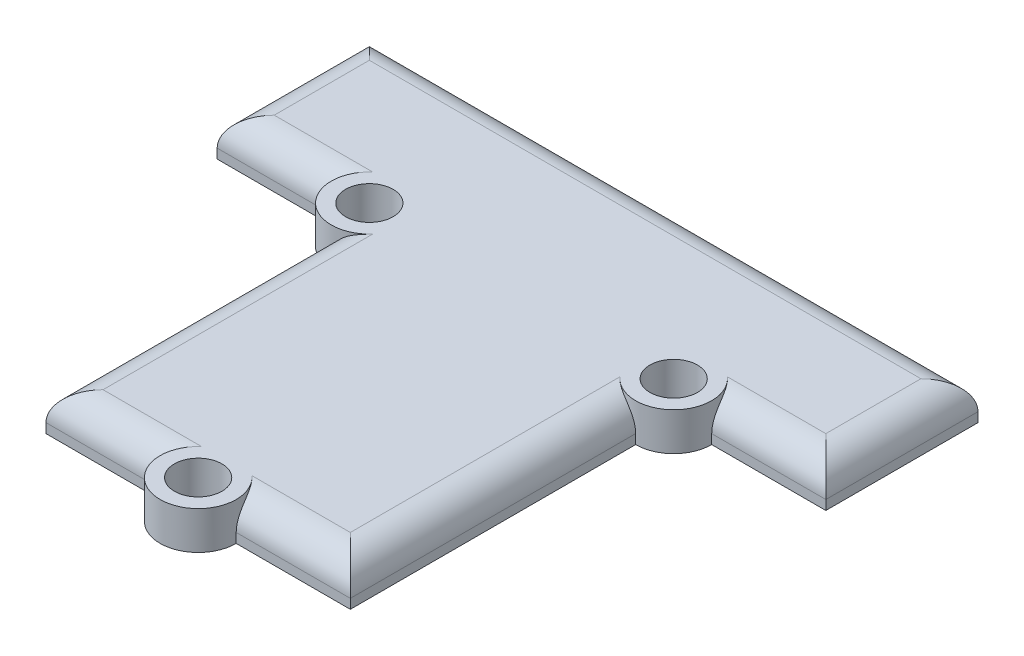
ISO-10303-21;
HEADER;
FILE_DESCRIPTION(('STEP AP214'),'2;1');
FILE_NAME('part.step','',(''),(''),'','','');
FILE_SCHEMA(('AUTOMOTIVE_DESIGN { 1 0 10303 214 1 1 1 1 }'));
ENDSEC;
DATA;
#1=APPLICATION_CONTEXT('core data for automotive mechanical design processes');
#2=APPLICATION_PROTOCOL_DEFINITION('international standard','automotive_design',2000,#1);
#3=PRODUCT_CONTEXT('',#1,'mechanical');
#4=PRODUCT('Part','Part','',(#3));
#5=PRODUCT_RELATED_PRODUCT_CATEGORY('part','',(#4));
#6=PRODUCT_DEFINITION_FORMATION('','',#4);
#7=PRODUCT_DEFINITION_CONTEXT('part definition',#1,'design');
#8=PRODUCT_DEFINITION('design','',#6,#7);
#9=PRODUCT_DEFINITION_SHAPE('','',#8);
#10=(LENGTH_UNIT() NAMED_UNIT(*) SI_UNIT(.MILLI.,.METRE.));
#11=(NAMED_UNIT(*) PLANE_ANGLE_UNIT() SI_UNIT($,.RADIAN.));
#12=(NAMED_UNIT(*) SI_UNIT($,.STERADIAN.) SOLID_ANGLE_UNIT());
#13=UNCERTAINTY_MEASURE_WITH_UNIT(LENGTH_MEASURE(1.E-05),#10,'distance_accuracy_value','');
#14=(GEOMETRIC_REPRESENTATION_CONTEXT(3) GLOBAL_UNCERTAINTY_ASSIGNED_CONTEXT((#13)) GLOBAL_UNIT_ASSIGNED_CONTEXT((#10,
#11,#12)) REPRESENTATION_CONTEXT('',''));
#15=CARTESIAN_POINT('',(0.,0.,0.));
#16=DIRECTION('',(0.,0.,1.));
#17=DIRECTION('',(1.,0.,0.));
#18=AXIS2_PLACEMENT_3D('',#15,#16,#17);
#19=CARTESIAN_POINT('',(8.,0.,17.));
#20=DIRECTION('',(0.,0.,1.));
#21=DIRECTION('',(1.,0.,0.));
#22=AXIS2_PLACEMENT_3D('',#19,#20,#21);
#23=PLANE('',#22);
#24=DIRECTION('',(0.,1.,0.));
#25=VECTOR('',#24,1.);
#26=CARTESIAN_POINT('',(24.,0.,17.));
#27=LINE('',#26,#25);
#28=CARTESIAN_POINT('',(24.,0.,17.));
#29=VERTEX_POINT('',#28);
#30=CARTESIAN_POINT('',(24.,0.5,17.));
#31=VERTEX_POINT('',#30);
#32=EDGE_CURVE('E199',#29,#31,#27,.T.);
#33=ORIENTED_EDGE('',*,*,#32,.T.);
#34=DIRECTION('',(1.,0.,0.));
#35=VECTOR('',#34,1.);
#36=CARTESIAN_POINT('',(18.,0.5,17.));
#37=LINE('',#36,#35);
#38=CARTESIAN_POINT('',(18.,0.5,17.));
#39=VERTEX_POINT('',#38);
#40=EDGE_CURVE('E182',#31,#39,#37,.F.);
#41=ORIENTED_EDGE('',*,*,#40,.T.);
#42=DIRECTION('',(0.,1.,0.));
#43=VECTOR('',#42,1.);
#44=CARTESIAN_POINT('',(18.,0.,17.));
#45=LINE('',#44,#43);
#46=CARTESIAN_POINT('',(18.,0.,17.));
#47=VERTEX_POINT('',#46);
#48=EDGE_CURVE('E166',#47,#39,#45,.T.);
#49=ORIENTED_EDGE('',*,*,#48,.F.);
#50=DIRECTION('',(1.,0.,0.));
#51=VECTOR('',#50,1.);
#52=CARTESIAN_POINT('',(8.,0.,17.));
#53=LINE('',#52,#51);
#54=EDGE_CURVE('E179',#47,#29,#53,.T.);
#55=ORIENTED_EDGE('',*,*,#54,.T.);
#56=EDGE_LOOP('',(#33,#41,#49,#55));
#57=FACE_BOUND('',#56,.T.);
#58=ADVANCED_FACE('F33',(#57),#23,.T.);
#59=CARTESIAN_POINT('',(0.,2.,0.));
#60=DIRECTION('',(0.,0.,-1.));
#61=DIRECTION('',(-1.,0.,0.));
#62=AXIS2_PLACEMENT_3D('',#59,#60,#61);
#63=PLANE('',#62);
#64=DIRECTION('',(0.,-1.,0.));
#65=VECTOR('',#64,1.);
#66=CARTESIAN_POINT('',(32.,2.,0.));
#67=LINE('',#66,#65);
#68=CARTESIAN_POINT('',(32.,0.5,0.));
#69=VERTEX_POINT('',#68);
#70=CARTESIAN_POINT('',(32.,0.,0.));
#71=VERTEX_POINT('',#70);
#72=EDGE_CURVE('E220',#69,#71,#67,.T.);
#73=ORIENTED_EDGE('',*,*,#72,.F.);
#74=DIRECTION('',(1.,0.,0.));
#75=VECTOR('',#74,1.);
#76=CARTESIAN_POINT('',(0.,0.5,0.));
#77=LINE('',#76,#75);
#78=CARTESIAN_POINT('',(26.,0.5,0.));
#79=VERTEX_POINT('',#78);
#80=EDGE_CURVE('E255',#69,#79,#77,.F.);
#81=ORIENTED_EDGE('',*,*,#80,.T.);
#82=DIRECTION('',(0.,1.,0.));
#83=VECTOR('',#82,1.);
#84=CARTESIAN_POINT('',(26.,0.,0.));
#85=LINE('',#84,#83);
#86=CARTESIAN_POINT('',(26.,0.,0.));
#87=VERTEX_POINT('',#86);
#88=EDGE_CURVE('E420',#79,#87,#85,.F.);
#89=ORIENTED_EDGE('',*,*,#88,.T.);
#90=DIRECTION('',(1.,0.,0.));
#91=VECTOR('',#90,1.);
#92=CARTESIAN_POINT('',(0.,0.,0.));
#93=LINE('',#92,#91);
#94=EDGE_CURVE('E206',#87,#71,#93,.T.);
#95=ORIENTED_EDGE('',*,*,#94,.T.);
#96=EDGE_LOOP('',(#73,#81,#89,#95));
#97=FACE_BOUND('',#96,.T.);
#98=ADVANCED_FACE('F353',(#97),#63,.F.);
#99=CARTESIAN_POINT('',(0.,2.,0.));
#100=DIRECTION('',(1.,0.,0.));
#101=DIRECTION('',(0.,0.,-1.));
#102=AXIS2_PLACEMENT_3D('',#99,#100,#101);
#103=PLANE('',#102);
#104=DIRECTION('',(0.,-1.,0.));
#105=VECTOR('',#104,1.);
#106=CARTESIAN_POINT('',(0.,2.,0.));
#107=LINE('',#106,#105);
#108=CARTESIAN_POINT('',(0.,0.5,0.));
#109=VERTEX_POINT('',#108);
#110=CARTESIAN_POINT('',(0.,0.,0.));
#111=VERTEX_POINT('',#110);
#112=EDGE_CURVE('E222',#109,#111,#107,.T.);
#113=ORIENTED_EDGE('',*,*,#112,.F.);
#114=DIRECTION('',(0.,0.,1.));
#115=VECTOR('',#114,1.);
#116=CARTESIAN_POINT('',(0.,0.5,0.));
#117=LINE('',#116,#115);
#118=CARTESIAN_POINT('',(0.,0.5,-8.));
#119=VERTEX_POINT('',#118);
#120=EDGE_CURVE('E51',#109,#119,#117,.F.);
#121=ORIENTED_EDGE('',*,*,#120,.T.);
#122=DIRECTION('',(0.,-1.,0.));
#123=VECTOR('',#122,1.);
#124=CARTESIAN_POINT('',(0.,2.,-8.));
#125=LINE('',#124,#123);
#126=CARTESIAN_POINT('',(0.,0.,-8.));
#127=VERTEX_POINT('',#126);
#128=EDGE_CURVE('E216',#119,#127,#125,.T.);
#129=ORIENTED_EDGE('',*,*,#128,.T.);
#130=DIRECTION('',(0.,0.,1.));
#131=VECTOR('',#130,1.);
#132=CARTESIAN_POINT('',(0.,0.,0.));
#133=LINE('',#132,#131);
#134=EDGE_CURVE('E201',#127,#111,#133,.T.);
#135=ORIENTED_EDGE('',*,*,#134,.T.);
#136=EDGE_LOOP('',(#113,#121,#129,#135));
#137=FACE_BOUND('',#136,.T.);
#138=ADVANCED_FACE('F359',(#137),#103,.F.);
#139=DIRECTION('',(0.,1.,0.));
#140=VECTOR('',#139,1.);
#141=CARTESIAN_POINT('',(6.,0.,0.));
#142=LINE('',#141,#140);
#143=CARTESIAN_POINT('',(6.,0.,0.));
#144=VERTEX_POINT('',#143);
#145=CARTESIAN_POINT('',(6.,0.5,0.));
#146=VERTEX_POINT('',#145);
#147=EDGE_CURVE('E193',#144,#146,#142,.T.);
#148=ORIENTED_EDGE('',*,*,#147,.T.);
#149=DIRECTION('',(1.,0.,0.));
#150=VECTOR('',#149,1.);
#151=CARTESIAN_POINT('',(0.,0.5,0.));
#152=LINE('',#151,#150);
#153=EDGE_CURVE('E257',#146,#109,#152,.F.);
#154=ORIENTED_EDGE('',*,*,#153,.T.);
#155=ORIENTED_EDGE('',*,*,#112,.T.);
#156=EDGE_CURVE('E207',#111,#144,#93,.T.);
#157=ORIENTED_EDGE('',*,*,#156,.T.);
#158=EDGE_LOOP('',(#148,#154,#155,#157));
#159=FACE_BOUND('',#158,.T.);
#160=ADVANCED_FACE('F362',(#159),#63,.F.);
#161=CARTESIAN_POINT('',(32.,2.,0.));
#162=DIRECTION('',(-1.,0.,0.));
#163=DIRECTION('',(0.,0.,1.));
#164=AXIS2_PLACEMENT_3D('',#161,#162,#163);
#165=PLANE('',#164);
#166=DIRECTION('',(0.,-1.,0.));
#167=VECTOR('',#166,1.);
#168=CARTESIAN_POINT('',(32.,2.,-8.));
#169=LINE('',#168,#167);
#170=CARTESIAN_POINT('',(32.,0.5,-8.));
#171=VERTEX_POINT('',#170);
#172=CARTESIAN_POINT('',(32.,0.,-8.));
#173=VERTEX_POINT('',#172);
#174=EDGE_CURVE('E218',#171,#173,#169,.T.);
#175=ORIENTED_EDGE('',*,*,#174,.F.);
#176=DIRECTION('',(0.,0.,-1.));
#177=VECTOR('',#176,1.);
#178=CARTESIAN_POINT('',(32.,0.5,0.));
#179=LINE('',#178,#177);
#180=EDGE_CURVE('E263',#171,#69,#179,.F.);
#181=ORIENTED_EDGE('',*,*,#180,.T.);
#182=ORIENTED_EDGE('',*,*,#72,.T.);
#183=DIRECTION('',(0.,0.,-1.));
#184=VECTOR('',#183,1.);
#185=CARTESIAN_POINT('',(32.,0.,0.));
#186=LINE('',#185,#184);
#187=EDGE_CURVE('E210',#71,#173,#186,.T.);
#188=ORIENTED_EDGE('',*,*,#187,.T.);
#189=EDGE_LOOP('',(#175,#181,#182,#188));
#190=FACE_BOUND('',#189,.T.);
#191=ADVANCED_FACE('F446',(#190),#165,.F.);
#192=CARTESIAN_POINT('',(0.,2.,-8.));
#193=DIRECTION('',(0.,0.,1.));
#194=DIRECTION('',(1.,0.,0.));
#195=AXIS2_PLACEMENT_3D('',#192,#193,#194);
#196=PLANE('',#195);
#197=ORIENTED_EDGE('',*,*,#128,.F.);
#198=DIRECTION('',(-1.,0.,0.));
#199=VECTOR('',#198,1.);
#200=CARTESIAN_POINT('',(0.,0.5,-8.));
#201=LINE('',#200,#199);
#202=EDGE_CURVE('E58',#119,#171,#201,.F.);
#203=ORIENTED_EDGE('',*,*,#202,.T.);
#204=ORIENTED_EDGE('',*,*,#174,.T.);
#205=DIRECTION('',(-1.,0.,0.));
#206=VECTOR('',#205,1.);
#207=CARTESIAN_POINT('',(0.,0.,-8.));
#208=LINE('',#207,#206);
#209=EDGE_CURVE('E213',#173,#127,#208,.T.);
#210=ORIENTED_EDGE('',*,*,#209,.T.);
#211=EDGE_LOOP('',(#197,#203,#204,#210));
#212=FACE_BOUND('',#211,.T.);
#213=ADVANCED_FACE('F442',(#212),#196,.F.);
#214=CARTESIAN_POINT('',(0.,2.,0.));
#215=DIRECTION('',(0.,-1.,0.));
#216=DIRECTION('',(0.,0.,-1.));
#217=AXIS2_PLACEMENT_3D('',#214,#215,#216);
#218=PLANE('',#217);
#219=CARTESIAN_POINT('',(16.,2.,17.));
#220=DIRECTION('',(0.,1.,0.));
#221=DIRECTION('',(0.,0.,1.));
#222=AXIS2_PLACEMENT_3D('',#219,#220,#221);
#223=CIRCLE('',#222,2.);
#224=CARTESIAN_POINT('',(14.6771243444677,2.,15.5));
#225=VERTEX_POINT('',#224);
#226=CARTESIAN_POINT('',(17.3228756555323,2.,15.5));
#227=VERTEX_POINT('',#226);
#228=EDGE_CURVE('E175',#225,#227,#223,.T.);
#229=ORIENTED_EDGE('',*,*,#228,.T.);
#230=DIRECTION('',(1.,0.,0.));
#231=VECTOR('',#230,1.);
#232=CARTESIAN_POINT('',(24.,2.,15.5));
#233=LINE('',#232,#231);
#234=CARTESIAN_POINT('',(22.5,2.,15.5));
#235=VERTEX_POINT('',#234);
#236=EDGE_CURVE('E249',#227,#235,#233,.T.);
#237=ORIENTED_EDGE('',*,*,#236,.T.);
#238=DIRECTION('',(0.,0.,-1.));
#239=VECTOR('',#238,1.);
#240=CARTESIAN_POINT('',(22.5,2.,2.));
#241=LINE('',#240,#239);
#242=CARTESIAN_POINT('',(22.5,2.,1.3228756555323));
#243=VERTEX_POINT('',#242);
#244=EDGE_CURVE('E246',#235,#243,#241,.T.);
#245=ORIENTED_EDGE('',*,*,#244,.T.);
#246=CARTESIAN_POINT('',(24.,2.,0.));
#247=DIRECTION('',(0.,1.,0.));
#248=DIRECTION('',(0.,0.,1.));
#249=AXIS2_PLACEMENT_3D('',#246,#247,#248);
#250=CIRCLE('',#249,2.);
#251=CARTESIAN_POINT('',(25.3228756555323,2.,-1.5));
#252=VERTEX_POINT('',#251);
#253=EDGE_CURVE('E174',#243,#252,#250,.T.);
#254=ORIENTED_EDGE('',*,*,#253,.T.);
#255=DIRECTION('',(1.,0.,0.));
#256=VECTOR('',#255,1.);
#257=CARTESIAN_POINT('',(0.,2.,-1.5));
#258=LINE('',#257,#256);
#259=CARTESIAN_POINT('',(30.5,2.,-1.5));
#260=VERTEX_POINT('',#259);
#261=EDGE_CURVE('E238',#252,#260,#258,.T.);
#262=ORIENTED_EDGE('',*,*,#261,.T.);
#263=DIRECTION('',(0.,0.,-1.));
#264=VECTOR('',#263,1.);
#265=CARTESIAN_POINT('',(30.5,2.,0.));
#266=LINE('',#265,#264);
#267=CARTESIAN_POINT('',(30.5,2.,-6.5));
#268=VERTEX_POINT('',#267);
#269=EDGE_CURVE('E233',#260,#268,#266,.T.);
#270=ORIENTED_EDGE('',*,*,#269,.T.);
#271=DIRECTION('',(-1.,0.,0.));
#272=VECTOR('',#271,1.);
#273=CARTESIAN_POINT('',(0.,2.,-6.5));
#274=LINE('',#273,#272);
#275=CARTESIAN_POINT('',(1.5,2.,-6.5));
#276=VERTEX_POINT('',#275);
#277=EDGE_CURVE('E183',#268,#276,#274,.T.);
#278=ORIENTED_EDGE('',*,*,#277,.T.);
#279=DIRECTION('',(0.,0.,1.));
#280=VECTOR('',#279,1.);
#281=CARTESIAN_POINT('',(1.5,2.,0.));
#282=LINE('',#281,#280);
#283=CARTESIAN_POINT('',(1.5,2.,-1.5));
#284=VERTEX_POINT('',#283);
#285=EDGE_CURVE('E231',#276,#284,#282,.T.);
#286=ORIENTED_EDGE('',*,*,#285,.T.);
#287=DIRECTION('',(1.,0.,0.));
#288=VECTOR('',#287,1.);
#289=CARTESIAN_POINT('',(0.,2.,-1.5));
#290=LINE('',#289,#288);
#291=CARTESIAN_POINT('',(6.67712434446771,2.,-1.5));
#292=VERTEX_POINT('',#291);
#293=EDGE_CURVE('E235',#284,#292,#290,.T.);
#294=ORIENTED_EDGE('',*,*,#293,.T.);
#295=CARTESIAN_POINT('',(8.,2.,0.));
#296=DIRECTION('',(0.,1.,0.));
#297=DIRECTION('',(0.,0.,1.));
#298=AXIS2_PLACEMENT_3D('',#295,#296,#297);
#299=CIRCLE('',#298,2.);
#300=CARTESIAN_POINT('',(9.5,2.,1.32287565553229));
#301=VERTEX_POINT('',#300);
#302=EDGE_CURVE('E423',#292,#301,#299,.T.);
#303=ORIENTED_EDGE('',*,*,#302,.T.);
#304=DIRECTION('',(0.,0.,1.));
#305=VECTOR('',#304,1.);
#306=CARTESIAN_POINT('',(9.5,2.,17.));
#307=LINE('',#306,#305);
#308=CARTESIAN_POINT('',(9.5,2.,15.5));
#309=VERTEX_POINT('',#308);
#310=EDGE_CURVE('E241',#301,#309,#307,.T.);
#311=ORIENTED_EDGE('',*,*,#310,.T.);
#312=DIRECTION('',(1.,0.,0.));
#313=VECTOR('',#312,1.);
#314=CARTESIAN_POINT('',(14.,2.,15.5));
#315=LINE('',#314,#313);
#316=EDGE_CURVE('E243',#309,#225,#315,.T.);
#317=ORIENTED_EDGE('',*,*,#316,.T.);
#318=EDGE_LOOP('',(#229,#237,#245,#254,#262,#270,#278,#286,#294,#303,#311,#317));
#319=FACE_BOUND('',#318,.T.);
#320=CARTESIAN_POINT('',(24.,2.,0.));
#321=DIRECTION('',(0.,1.,0.));
#322=DIRECTION('',(0.,0.,1.));
#323=AXIS2_PLACEMENT_3D('',#320,#321,#322);
#324=CIRCLE('',#323,1.25);
#325=CARTESIAN_POINT('',(24.,2.,1.25));
#326=VERTEX_POINT('',#325);
#327=EDGE_CURVE('E654',#326,#326,#324,.T.);
#328=ORIENTED_EDGE('',*,*,#327,.F.);
#329=EDGE_LOOP('',(#328));
#330=FACE_BOUND('',#329,.T.);
#331=CARTESIAN_POINT('',(16.,2.,17.));
#332=DIRECTION('',(0.,1.,0.));
#333=DIRECTION('',(0.,0.,1.));
#334=AXIS2_PLACEMENT_3D('',#331,#332,#333);
#335=CIRCLE('',#334,1.25);
#336=CARTESIAN_POINT('',(16.,2.,18.25));
#337=VERTEX_POINT('',#336);
#338=EDGE_CURVE('E385',#337,#337,#335,.T.);
#339=ORIENTED_EDGE('',*,*,#338,.F.);
#340=EDGE_LOOP('',(#339));
#341=FACE_BOUND('',#340,.T.);
#342=CARTESIAN_POINT('',(8.,2.,0.));
#343=DIRECTION('',(0.,1.,0.));
#344=DIRECTION('',(0.,0.,1.));
#345=AXIS2_PLACEMENT_3D('',#342,#343,#344);
#346=CIRCLE('',#345,1.25);
#347=CARTESIAN_POINT('',(8.,2.,1.25));
#348=VERTEX_POINT('',#347);
#349=EDGE_CURVE('E413',#348,#348,#346,.T.);
#350=ORIENTED_EDGE('',*,*,#349,.F.);
#351=EDGE_LOOP('',(#350));
#352=FACE_BOUND('',#351,.T.);
#353=ADVANCED_FACE('F400',(#319,#330,#341,#352),#218,.F.);
#354=CARTESIAN_POINT('',(0.,0.,0.));
#355=DIRECTION('',(0.,-1.,0.));
#356=DIRECTION('',(0.,0.,-1.));
#357=AXIS2_PLACEMENT_3D('',#354,#355,#356);
#358=PLANE('',#357);
#359=CARTESIAN_POINT('',(24.,0.,0.));
#360=DIRECTION('',(0.,1.,0.));
#361=DIRECTION('',(0.,0.,1.));
#362=AXIS2_PLACEMENT_3D('',#359,#360,#361);
#363=CIRCLE('',#362,1.25);
#364=CARTESIAN_POINT('',(24.,0.,1.25));
#365=VERTEX_POINT('',#364);
#366=EDGE_CURVE('E652',#365,#365,#363,.T.);
#367=ORIENTED_EDGE('',*,*,#366,.T.);
#368=EDGE_LOOP('',(#367));
#369=FACE_BOUND('',#368,.T.);
#370=CARTESIAN_POINT('',(16.,0.,17.));
#371=DIRECTION('',(0.,1.,0.));
#372=DIRECTION('',(0.,0.,1.));
#373=AXIS2_PLACEMENT_3D('',#370,#371,#372);
#374=CIRCLE('',#373,1.25);
#375=CARTESIAN_POINT('',(16.,0.,18.25));
#376=VERTEX_POINT('',#375);
#377=EDGE_CURVE('E659',#376,#376,#374,.T.);
#378=ORIENTED_EDGE('',*,*,#377,.T.);
#379=EDGE_LOOP('',(#378));
#380=FACE_BOUND('',#379,.T.);
#381=CARTESIAN_POINT('',(8.,0.,0.));
#382=DIRECTION('',(0.,1.,0.));
#383=DIRECTION('',(0.,0.,1.));
#384=AXIS2_PLACEMENT_3D('',#381,#382,#383);
#385=CIRCLE('',#384,1.25);
#386=CARTESIAN_POINT('',(8.,0.,1.25));
#387=VERTEX_POINT('',#386);
#388=EDGE_CURVE('E410',#387,#387,#385,.T.);
#389=ORIENTED_EDGE('',*,*,#388,.T.);
#390=EDGE_LOOP('',(#389));
#391=FACE_BOUND('',#390,.T.);
#392=ORIENTED_EDGE('',*,*,#54,.F.);
#393=CARTESIAN_POINT('',(16.,0.,17.));
#394=DIRECTION('',(0.,1.,0.));
#395=DIRECTION('',(0.,0.,1.));
#396=AXIS2_PLACEMENT_3D('',#393,#394,#395);
#397=CIRCLE('',#396,2.);
#398=CARTESIAN_POINT('',(14.,0.,17.));
#399=VERTEX_POINT('',#398);
#400=EDGE_CURVE('E162',#399,#47,#397,.T.);
#401=ORIENTED_EDGE('',*,*,#400,.F.);
#402=CARTESIAN_POINT('',(8.,0.,17.));
#403=VERTEX_POINT('',#402);
#404=EDGE_CURVE('E190',#403,#399,#53,.T.);
#405=ORIENTED_EDGE('',*,*,#404,.F.);
#406=DIRECTION('',(0.,0.,1.));
#407=VECTOR('',#406,1.);
#408=CARTESIAN_POINT('',(8.,0.,0.));
#409=LINE('',#408,#407);
#410=CARTESIAN_POINT('',(8.,0.,2.));
#411=VERTEX_POINT('',#410);
#412=EDGE_CURVE('E191',#411,#403,#409,.T.);
#413=ORIENTED_EDGE('',*,*,#412,.F.);
#414=CARTESIAN_POINT('',(8.,0.,0.));
#415=DIRECTION('',(0.,1.,0.));
#416=DIRECTION('',(0.,0.,1.));
#417=AXIS2_PLACEMENT_3D('',#414,#415,#416);
#418=CIRCLE('',#417,2.);
#419=EDGE_CURVE('E424',#144,#411,#418,.T.);
#420=ORIENTED_EDGE('',*,*,#419,.F.);
#421=ORIENTED_EDGE('',*,*,#156,.F.);
#422=ORIENTED_EDGE('',*,*,#134,.F.);
#423=ORIENTED_EDGE('',*,*,#209,.F.);
#424=ORIENTED_EDGE('',*,*,#187,.F.);
#425=ORIENTED_EDGE('',*,*,#94,.F.);
#426=CARTESIAN_POINT('',(24.,0.,0.));
#427=DIRECTION('',(0.,1.,0.));
#428=DIRECTION('',(0.,0.,1.));
#429=AXIS2_PLACEMENT_3D('',#426,#427,#428);
#430=CIRCLE('',#429,2.);
#431=CARTESIAN_POINT('',(24.,0.,2.));
#432=VERTEX_POINT('',#431);
#433=EDGE_CURVE('E417',#432,#87,#430,.T.);
#434=ORIENTED_EDGE('',*,*,#433,.F.);
#435=DIRECTION('',(0.,0.,-1.));
#436=VECTOR('',#435,1.);
#437=CARTESIAN_POINT('',(24.,0.,0.));
#438=LINE('',#437,#436);
#439=EDGE_CURVE('E189',#29,#432,#438,.T.);
#440=ORIENTED_EDGE('',*,*,#439,.F.);
#441=EDGE_LOOP('',(#392,#401,#405,#413,#420,#421,#422,#423,#424,#425,#434,#440));
#442=FACE_BOUND('',#441,.T.);
#443=ADVANCED_FACE('F186',(#369,#380,#391,#442),#358,.T.);
#444=CARTESIAN_POINT('',(8.,0.,0.));
#445=DIRECTION('',(-1.,0.,0.));
#446=DIRECTION('',(0.,0.,1.));
#447=AXIS2_PLACEMENT_3D('',#444,#445,#446);
#448=PLANE('',#447);
#449=DIRECTION('',(0.,1.,0.));
#450=VECTOR('',#449,1.);
#451=CARTESIAN_POINT('',(8.,0.,17.));
#452=LINE('',#451,#450);
#453=CARTESIAN_POINT('',(8.,0.5,17.));
#454=VERTEX_POINT('',#453);
#455=EDGE_CURVE('E198',#403,#454,#452,.T.);
#456=ORIENTED_EDGE('',*,*,#455,.T.);
#457=DIRECTION('',(0.,0.,1.));
#458=VECTOR('',#457,1.);
#459=CARTESIAN_POINT('',(8.,0.5,2.));
#460=LINE('',#459,#458);
#461=CARTESIAN_POINT('',(8.,0.5,2.));
#462=VERTEX_POINT('',#461);
#463=EDGE_CURVE('E261',#454,#462,#460,.F.);
#464=ORIENTED_EDGE('',*,*,#463,.T.);
#465=DIRECTION('',(0.,1.,0.));
#466=VECTOR('',#465,1.);
#467=CARTESIAN_POINT('',(8.,0.,2.));
#468=LINE('',#467,#466);
#469=EDGE_CURVE('E224',#411,#462,#468,.T.);
#470=ORIENTED_EDGE('',*,*,#469,.F.);
#471=ORIENTED_EDGE('',*,*,#412,.T.);
#472=EDGE_LOOP('',(#456,#464,#470,#471));
#473=FACE_BOUND('',#472,.T.);
#474=ADVANCED_FACE('F372',(#473),#448,.T.);
#475=CARTESIAN_POINT('',(24.,0.,0.));
#476=DIRECTION('',(1.,0.,0.));
#477=DIRECTION('',(0.,0.,-1.));
#478=AXIS2_PLACEMENT_3D('',#475,#476,#477);
#479=PLANE('',#478);
#480=DIRECTION('',(0.,1.,0.));
#481=VECTOR('',#480,1.);
#482=CARTESIAN_POINT('',(24.,0.,2.));
#483=LINE('',#482,#481);
#484=CARTESIAN_POINT('',(24.,0.5,2.));
#485=VERTEX_POINT('',#484);
#486=EDGE_CURVE('E227',#485,#432,#483,.F.);
#487=ORIENTED_EDGE('',*,*,#486,.F.);
#488=DIRECTION('',(0.,0.,-1.));
#489=VECTOR('',#488,1.);
#490=CARTESIAN_POINT('',(24.,0.5,17.));
#491=LINE('',#490,#489);
#492=EDGE_CURVE('E259',#485,#31,#491,.F.);
#493=ORIENTED_EDGE('',*,*,#492,.T.);
#494=ORIENTED_EDGE('',*,*,#32,.F.);
#495=ORIENTED_EDGE('',*,*,#439,.T.);
#496=EDGE_LOOP('',(#487,#493,#494,#495));
#497=FACE_BOUND('',#496,.T.);
#498=ADVANCED_FACE('F365',(#497),#479,.T.);
#499=DIRECTION('',(0.,1.,0.));
#500=VECTOR('',#499,1.);
#501=CARTESIAN_POINT('',(14.,0.,17.));
#502=LINE('',#501,#500);
#503=CARTESIAN_POINT('',(14.,0.5,17.));
#504=VERTEX_POINT('',#503);
#505=EDGE_CURVE('E169',#504,#399,#502,.F.);
#506=ORIENTED_EDGE('',*,*,#505,.F.);
#507=DIRECTION('',(1.,0.,0.));
#508=VECTOR('',#507,1.);
#509=CARTESIAN_POINT('',(8.,0.5,17.));
#510=LINE('',#509,#508);
#511=EDGE_CURVE('E253',#504,#454,#510,.F.);
#512=ORIENTED_EDGE('',*,*,#511,.T.);
#513=ORIENTED_EDGE('',*,*,#455,.F.);
#514=ORIENTED_EDGE('',*,*,#404,.T.);
#515=EDGE_LOOP('',(#506,#512,#513,#514));
#516=FACE_BOUND('',#515,.T.);
#517=ADVANCED_FACE('F355',(#516),#23,.T.);
#518=CARTESIAN_POINT('',(8.,0.,0.));
#519=DIRECTION('',(0.,1.,0.));
#520=DIRECTION('',(0.,0.,1.));
#521=AXIS2_PLACEMENT_3D('',#518,#519,#520);
#522=CYLINDRICAL_SURFACE('',#521,2.);
#523=ORIENTED_EDGE('',*,*,#147,.F.);
#524=ORIENTED_EDGE('',*,*,#419,.T.);
#525=ORIENTED_EDGE('',*,*,#469,.T.);
#526=CARTESIAN_POINT('',(8.,0.5,2.));
#527=CARTESIAN_POINT('',(7.99999607770646,0.541946559148182,1.9999902888586));
#528=CARTESIAN_POINT('',(8.00175951082245,0.583891180581978,1.99999975008741));
#529=CARTESIAN_POINT('',(8.00879068134765,0.667484726392601,1.99998633697832));
#530=CARTESIAN_POINT('',(8.01405833448811,0.709133657855778,1.99996346341799));
#531=CARTESIAN_POINT('',(8.02807205495535,0.791872696915188,1.99981465882636));
#532=CARTESIAN_POINT('',(8.03682036154643,0.832962427117321,1.99968866139547));
#533=CARTESIAN_POINT('',(8.05772426417661,0.914251777793105,1.99919384679136));
#534=CARTESIAN_POINT('',(8.06987981763219,0.954451409384373,1.99882503265278));
#535=CARTESIAN_POINT('',(8.11136836514921,1.0733544917496,1.99709219139483));
#536=CARTESIAN_POINT('',(8.14572432805863,1.15036848355518,1.99510180451013));
#537=CARTESIAN_POINT('',(8.2267207781607,1.29737295637112,1.98752103179161));
#538=CARTESIAN_POINT('',(8.27335431955456,1.36736737774542,1.98193267886073));
#539=CARTESIAN_POINT('',(8.37606566932473,1.49670815735007,1.96499720061908));
#540=CARTESIAN_POINT('',(8.43190407340373,1.55626079790202,1.95378419358573));
#541=CARTESIAN_POINT('',(8.55128720364633,1.66465851545117,1.92350028746217));
#542=CARTESIAN_POINT('',(8.61482522502794,1.71351280590073,1.90443619084387));
#543=CARTESIAN_POINT('',(8.74071167731958,1.79562719506099,1.85888083218933));
#544=CARTESIAN_POINT('',(8.80270648261987,1.82985653104275,1.83315381059178));
#545=CARTESIAN_POINT('',(8.92742663776571,1.88812766834647,1.77331806441589));
#546=CARTESIAN_POINT('',(8.990152015545,1.91216907880632,1.73920901833856));
#547=CARTESIAN_POINT('',(9.11170724372444,1.95023308446675,1.66405288566768));
#548=CARTESIAN_POINT('',(9.17059735760956,1.96452759202934,1.62323732917102));
#549=CARTESIAN_POINT('',(9.28441487748984,1.98555517557292,1.53475490099506));
#550=CARTESIAN_POINT('',(9.33934265831709,1.99228896766888,1.48708867866069));
#551=CARTESIAN_POINT('',(9.41037594883907,1.9974394195184,1.41828442464023));
#552=CARTESIAN_POINT('',(9.42884230067741,1.99842100648441,1.3996781867191));
#553=CARTESIAN_POINT('',(9.46499786292316,1.9997000886139,1.36178684488777));
#554=CARTESIAN_POINT('',(9.48268881803748,1.99999920607102,1.34250346175015));
#555=CARTESIAN_POINT('',(9.5,2.,1.3228756555323));
#556=B_SPLINE_CURVE_WITH_KNOTS('',3,(#526,#527,#528,#529,#530,#531,#532,#533,#534,#535,#536,
#537,#538,#539,#540,#541,#542,#543,#544,#545,#546,#547,#548,#549,#550,#551,#552,#553,#554,#555),
.UNSPECIFIED.,.F.,.F.,(4,2,2,2,2,2,2,2,2,2,2,2,2,2,4),(0.,0.125799106171616,0.251595187261788,
0.377472329955394,0.503347899515301,0.755079946838221,1.00666988658008,1.25252720643735,
1.49817195317649,1.72304766611779,1.94793200568661,2.16625333458765,2.38455398338743,
2.46323246948829,2.54172373376826),.UNSPECIFIED.);
#557=EDGE_CURVE('E11',#462,#301,#556,.T.);
#558=ORIENTED_EDGE('',*,*,#557,.T.);
#559=ORIENTED_EDGE('',*,*,#302,.F.);
#560=CARTESIAN_POINT('',(6.67712434446771,2.,-1.5));
#561=CARTESIAN_POINT('',(6.64617863221622,2.00000012168678,-1.47271585943136));
#562=CARTESIAN_POINT('',(6.61607562625208,1.99925518774951,-1.44445794048581));
#563=CARTESIAN_POINT('',(6.55769498504083,1.99595957790125,-1.38616521244539));
#564=CARTESIAN_POINT('',(6.52941905751921,1.99340723855101,-1.35612878986475));
#565=CARTESIAN_POINT('',(6.47476337706767,1.98616321982257,-1.2943574191942));
#566=CARTESIAN_POINT('',(6.44839305491351,1.98146164557726,-1.26261522099847));
#567=CARTESIAN_POINT('',(6.3978763797586,1.96962678483398,-1.1978691862535));
#568=CARTESIAN_POINT('',(6.37372935639783,1.96249423438387,-1.16486573426745));
#569=CARTESIAN_POINT('',(6.30454775656122,1.93690931304232,-1.06399209329386));
#570=CARTESIAN_POINT('',(6.26308145738925,1.91430342350568,-0.994610189180187));
#571=CARTESIAN_POINT('',(6.1906665509325,1.85670585643561,-0.855821328552948));
#572=CARTESIAN_POINT('',(6.1596830178555,1.82175611708074,-0.786415242125776));
#573=CARTESIAN_POINT('',(6.11053800500829,1.74395863054337,-0.658855876529455));
#574=CARTESIAN_POINT('',(6.09133917097525,1.70240731412232,-0.600305833910024));
#575=CARTESIAN_POINT('',(6.05976081466989,1.61020219214495,-0.488716071473103));
#576=CARTESIAN_POINT('',(6.04738873660321,1.55953852955035,-0.435682417894294));
#577=CARTESIAN_POINT('',(6.02803939167749,1.450701810932,-0.337451209086815));
#578=CARTESIAN_POINT('',(6.02103690741205,1.39256537263932,-0.292217807942128));
#579=CARTESIAN_POINT('',(6.01069848036091,1.2700622184323,-0.210649937756514));
#580=CARTESIAN_POINT('',(6.0073636088162,1.20569368821053,-0.17431807109414));
#581=CARTESIAN_POINT('',(6.00266736027039,1.06654364906209,-0.108799085068918));
#582=CARTESIAN_POINT('',(6.00149942164722,0.9913424576425,-0.0804901480029739));
#583=CARTESIAN_POINT('',(6.0002046449316,0.837419313960214,-0.0362557969080838));
#584=CARTESIAN_POINT('',(6.00007677307176,0.758700935873489,-0.0203181008274108));
#585=CARTESIAN_POINT('',(6.00001097230058,0.64952837024946,-0.0071688974238957));
#586=CARTESIAN_POINT('',(6.00000427916049,0.619658148937983,-0.00447917795328115));
#587=CARTESIAN_POINT('',(5.99999933233345,0.559862488769347,-0.000896914078392745));
#588=CARTESIAN_POINT('',(6.00000106391698,0.529937237659808,-1.23689229948793E-06));
#589=CARTESIAN_POINT('',(6.,0.5,0.));
#590=B_SPLINE_CURVE_WITH_KNOTS('',3,(#560,#561,#562,#563,#564,#565,#566,#567,#568,#569,#570,
#571,#572,#573,#574,#575,#576,#577,#578,#579,#580,#581,#582,#583,#584,#585,#586,#587,#588,#589),
.UNSPECIFIED.,.F.,.F.,(4,2,2,2,2,2,2,2,2,2,2,2,2,2,4),(0.,0.123758775729845,0.247631600700808,
0.372080558669209,0.496491869566244,0.746702668648528,0.996071427960394,1.21793355376489,
1.44003713243128,1.66109113964252,1.882209695456,2.12226220783515,2.36207609243684,
2.45200764391023,2.54178201825928),.UNSPECIFIED.);
#591=EDGE_CURVE('E310',#292,#146,#590,.T.);
#592=ORIENTED_EDGE('',*,*,#591,.T.);
#593=EDGE_LOOP('',(#523,#524,#525,#558,#559,#592));
#594=FACE_BOUND('',#593,.T.);
#595=ADVANCED_FACE('F295',(#594),#522,.T.);
#596=CARTESIAN_POINT('',(24.,0.,0.));
#597=DIRECTION('',(0.,1.,0.));
#598=DIRECTION('',(0.,0.,1.));
#599=AXIS2_PLACEMENT_3D('',#596,#597,#598);
#600=CYLINDRICAL_SURFACE('',#599,2.);
#601=ORIENTED_EDGE('',*,*,#88,.F.);
#602=CARTESIAN_POINT('',(26.,0.5,0.));
#603=CARTESIAN_POINT('',(25.9999902888586,0.541946559148182,3.92229353681629E-06));
#604=CARTESIAN_POINT('',(25.9999997500874,0.583891180581978,-0.00175951082244816));
#605=CARTESIAN_POINT('',(25.9999863369783,0.667484726392601,-0.00879068134764903));
#606=CARTESIAN_POINT('',(25.999963463418,0.709133657855778,-0.0140583344881091));
#607=CARTESIAN_POINT('',(25.9998146588264,0.791872696915189,-0.0280720549553426));
#608=CARTESIAN_POINT('',(25.9996886613955,0.832962427117321,-0.0368203615464238));
#609=CARTESIAN_POINT('',(25.9991938467914,0.914251777793105,-0.0577242641766127));
#610=CARTESIAN_POINT('',(25.9988250326528,0.954451409384373,-0.0698798176321843));
#611=CARTESIAN_POINT('',(25.9970921913948,1.0733544917496,-0.111368365149205));
#612=CARTESIAN_POINT('',(25.9951018045101,1.15036848355518,-0.145724328058624));
#613=CARTESIAN_POINT('',(25.9875210317916,1.29737295637112,-0.226720778160698));
#614=CARTESIAN_POINT('',(25.9819326788607,1.36736737774542,-0.27335431955456));
#615=CARTESIAN_POINT('',(25.9649972006191,1.49670815735007,-0.376065669324734));
#616=CARTESIAN_POINT('',(25.9537841935857,1.55626079790202,-0.431904073403729));
#617=CARTESIAN_POINT('',(25.9235002874622,1.66465851545117,-0.551287203646326));
#618=CARTESIAN_POINT('',(25.9044361908439,1.71351280590073,-0.614825225027936));
#619=CARTESIAN_POINT('',(25.8588808321893,1.79562719506099,-0.740711677319581));
#620=CARTESIAN_POINT('',(25.8331538105918,1.82985653104275,-0.802706482619868));
#621=CARTESIAN_POINT('',(25.7733180644159,1.88812766834647,-0.927426637765709));
#622=CARTESIAN_POINT('',(25.7392090183386,1.91216907880632,-0.990152015545001));
#623=CARTESIAN_POINT('',(25.6640528856677,1.95023308446675,-1.11170724372444));
#624=CARTESIAN_POINT('',(25.623237329171,1.96452759202934,-1.17059735760956));
#625=CARTESIAN_POINT('',(25.5347549009951,1.98555517557292,-1.28441487748984));
#626=CARTESIAN_POINT('',(25.4870886786607,1.99228896766888,-1.33934265831709));
#627=CARTESIAN_POINT('',(25.4182844246402,1.9974394195184,-1.41037594883907));
#628=CARTESIAN_POINT('',(25.3996781867191,1.99842100648441,-1.42884230067742));
#629=CARTESIAN_POINT('',(25.3617868448878,1.9997000886139,-1.46499786292316));
#630=CARTESIAN_POINT('',(25.3425034617502,1.99999920607102,-1.48268881803748));
#631=CARTESIAN_POINT('',(25.3228756555323,2.,-1.5));
#632=B_SPLINE_CURVE_WITH_KNOTS('',3,(#602,#603,#604,#605,#606,#607,#608,#609,#610,#611,#612,
#613,#614,#615,#616,#617,#618,#619,#620,#621,#622,#623,#624,#625,#626,#627,#628,#629,#630,#631),
.UNSPECIFIED.,.F.,.F.,(4,2,2,2,2,2,2,2,2,2,2,2,2,2,4),(0.,0.125799106171615,0.251595187261788,
0.377472329955394,0.503347899515301,0.755079946838221,1.00666988658008,1.25252720643736,
1.49817195317649,1.72304766611779,1.94793200568661,2.16625333458765,2.38455398338743,
2.46323246948829,2.54172373376826),.UNSPECIFIED.);
#633=EDGE_CURVE('E300',#79,#252,#632,.T.);
#634=ORIENTED_EDGE('',*,*,#633,.T.);
#635=ORIENTED_EDGE('',*,*,#253,.F.);
#636=CARTESIAN_POINT('',(22.5,2.,1.3228756555323));
#637=CARTESIAN_POINT('',(22.5272841405686,2.00000012168678,1.35382136778378));
#638=CARTESIAN_POINT('',(22.5555420595142,1.99925518774951,1.38392437374792));
#639=CARTESIAN_POINT('',(22.6138347875546,1.99595957790125,1.44230501495917));
#640=CARTESIAN_POINT('',(22.6438712101352,1.99340723855101,1.47058094248079));
#641=CARTESIAN_POINT('',(22.7056425808058,1.98616321982257,1.52523662293234));
#642=CARTESIAN_POINT('',(22.7373847790015,1.98146164557726,1.55160694508649));
#643=CARTESIAN_POINT('',(22.8021308137465,1.96962678483398,1.60212362024141));
#644=CARTESIAN_POINT('',(22.8351342657326,1.96249423438387,1.62627064360217));
#645=CARTESIAN_POINT('',(22.9360079067061,1.93690931304232,1.69545224343878));
#646=CARTESIAN_POINT('',(23.0053898108198,1.91430342350568,1.73691854261075));
#647=CARTESIAN_POINT('',(23.1441786714471,1.8567058564356,1.80933344906751));
#648=CARTESIAN_POINT('',(23.2135847578742,1.82175611708073,1.84031698214451));
#649=CARTESIAN_POINT('',(23.3411441234705,1.74395863054337,1.88946199499171));
#650=CARTESIAN_POINT('',(23.39969416609,1.70240731412232,1.90866082902476));
#651=CARTESIAN_POINT('',(23.5112839285269,1.61020219214495,1.94023918533011));
#652=CARTESIAN_POINT('',(23.5643175821057,1.55953852955035,1.95261126339679));
#653=CARTESIAN_POINT('',(23.6625487909132,1.450701810932,1.97196060832251));
#654=CARTESIAN_POINT('',(23.7077821920579,1.39256537263931,1.97896309258795));
#655=CARTESIAN_POINT('',(23.7893500622435,1.2700622184323,1.98930151963909));
#656=CARTESIAN_POINT('',(23.8256819289059,1.20569368821053,1.99263639118381));
#657=CARTESIAN_POINT('',(23.8912009149311,1.06654364906208,1.99733263972961));
#658=CARTESIAN_POINT('',(23.919509851997,0.991342457642493,1.99850057835278));
#659=CARTESIAN_POINT('',(23.9637442030919,0.837419313960207,1.99979535506841));
#660=CARTESIAN_POINT('',(23.9796818991726,0.758700935873482,1.99992322692824));
#661=CARTESIAN_POINT('',(23.9928311025761,0.649528370249454,1.99998902769942));
#662=CARTESIAN_POINT('',(23.9955208220467,0.619658148937978,1.99999572083952));
#663=CARTESIAN_POINT('',(23.9991030859216,0.559862488769345,2.00000066766655));
#664=CARTESIAN_POINT('',(23.9999987631077,0.529937237659807,1.99999893608303));
#665=CARTESIAN_POINT('',(24.,0.5,2.));
#666=B_SPLINE_CURVE_WITH_KNOTS('',3,(#636,#637,#638,#639,#640,#641,#642,#643,#644,#645,#646,
#647,#648,#649,#650,#651,#652,#653,#654,#655,#656,#657,#658,#659,#660,#661,#662,#663,#664,#665),
.UNSPECIFIED.,.F.,.F.,(4,2,2,2,2,2,2,2,2,2,2,2,2,2,4),(0.,0.123758775729843,0.24763160070081,
0.372080558669215,0.496491869566248,0.746702668648533,0.996071427960401,1.2179335537649,
1.44003713243129,1.66109113964253,1.88220969545601,2.12226220783516,2.36207609243684,
2.45200764391024,2.54178201825928),.UNSPECIFIED.);
#667=EDGE_CURVE('E43',#243,#485,#666,.T.);
#668=ORIENTED_EDGE('',*,*,#667,.T.);
#669=ORIENTED_EDGE('',*,*,#486,.T.);
#670=ORIENTED_EDGE('',*,*,#433,.T.);
#671=EDGE_LOOP('',(#601,#634,#635,#668,#669,#670));
#672=FACE_BOUND('',#671,.T.);
#673=ADVANCED_FACE('F289',(#672),#600,.T.);
#674=CARTESIAN_POINT('',(16.,0.,17.));
#675=DIRECTION('',(0.,1.,0.));
#676=DIRECTION('',(0.,0.,1.));
#677=AXIS2_PLACEMENT_3D('',#674,#675,#676);
#678=CYLINDRICAL_SURFACE('',#677,2.);
#679=ORIENTED_EDGE('',*,*,#400,.T.);
#680=ORIENTED_EDGE('',*,*,#48,.T.);
#681=CARTESIAN_POINT('',(18.,0.5,17.));
#682=CARTESIAN_POINT('',(17.9999902888586,0.541946559148182,17.0000039222935));
#683=CARTESIAN_POINT('',(17.9999997500874,0.583891180581978,16.9982404891776));
#684=CARTESIAN_POINT('',(17.9999863369783,0.6674847263926,16.9912093186524));
#685=CARTESIAN_POINT('',(17.999963463418,0.709133657855777,16.9859416655119));
#686=CARTESIAN_POINT('',(17.9998146588264,0.791872696915188,16.9719279450447));
#687=CARTESIAN_POINT('',(17.9996886613955,0.832962427117321,16.9631796384536));
#688=CARTESIAN_POINT('',(17.9991938467914,0.914251777793106,16.9422757358234));
#689=CARTESIAN_POINT('',(17.9988250326528,0.954451409384374,16.9301201823678));
#690=CARTESIAN_POINT('',(17.9970921913948,1.0733544917496,16.8886316348508));
#691=CARTESIAN_POINT('',(17.9951018045101,1.15036848355518,16.8542756719414));
#692=CARTESIAN_POINT('',(17.9875210317916,1.29737295637112,16.7732792218393));
#693=CARTESIAN_POINT('',(17.9819326788607,1.36736737774542,16.7266456804454));
#694=CARTESIAN_POINT('',(17.9649972006191,1.49670815735007,16.6239343306753));
#695=CARTESIAN_POINT('',(17.9537841935857,1.55626079790202,16.5680959265963));
#696=CARTESIAN_POINT('',(17.9235002874622,1.66465851545117,16.4487127963537));
#697=CARTESIAN_POINT('',(17.9044361908439,1.71351280590073,16.3851747749721));
#698=CARTESIAN_POINT('',(17.8588808321893,1.79562719506099,16.2592883226804));
#699=CARTESIAN_POINT('',(17.8331538105918,1.82985653104275,16.1972935173801));
#700=CARTESIAN_POINT('',(17.7733180644159,1.88812766834647,16.0725733622343));
#701=CARTESIAN_POINT('',(17.7392090183386,1.91216907880632,16.009847984455));
#702=CARTESIAN_POINT('',(17.6640528856677,1.95023308446675,15.8882927562756));
#703=CARTESIAN_POINT('',(17.623237329171,1.96452759202934,15.8294026423904));
#704=CARTESIAN_POINT('',(17.5347549009951,1.98555517557292,15.7155851225102));
#705=CARTESIAN_POINT('',(17.4870886786607,1.99228896766888,15.6606573416829));
#706=CARTESIAN_POINT('',(17.4182844246402,1.9974394195184,15.5896240511609));
#707=CARTESIAN_POINT('',(17.3996781867191,1.99842100648441,15.5711576993226));
#708=CARTESIAN_POINT('',(17.3617868448878,1.9997000886139,15.5350021370768));
#709=CARTESIAN_POINT('',(17.3425034617502,1.99999920607102,15.5173111819625));
#710=CARTESIAN_POINT('',(17.3228756555323,2.,15.5));
#711=B_SPLINE_CURVE_WITH_KNOTS('',3,(#681,#682,#683,#684,#685,#686,#687,#688,#689,#690,#691,
#692,#693,#694,#695,#696,#697,#698,#699,#700,#701,#702,#703,#704,#705,#706,#707,#708,#709,#710),
.UNSPECIFIED.,.F.,.F.,(4,2,2,2,2,2,2,2,2,2,2,2,2,2,4),(0.,0.125799106171615,0.251595187261788,
0.377472329955394,0.503347899515302,0.755079946838221,1.00666988658008,1.25252720643736,
1.4981719531765,1.72304766611779,1.94793200568661,2.16625333458765,2.38455398338743,
2.46323246948829,2.54172373376827),.UNSPECIFIED.);
#712=EDGE_CURVE('E267',#39,#227,#711,.T.);
#713=ORIENTED_EDGE('',*,*,#712,.T.);
#714=ORIENTED_EDGE('',*,*,#228,.F.);
#715=CARTESIAN_POINT('',(14.6771243444677,2.,15.5));
#716=CARTESIAN_POINT('',(14.6461786322162,2.00000012168678,15.5272841405686));
#717=CARTESIAN_POINT('',(14.6160756262521,1.99925518774951,15.5555420595142));
#718=CARTESIAN_POINT('',(14.5576949850408,1.99595957790125,15.6138347875546));
#719=CARTESIAN_POINT('',(14.5294190575192,1.99340723855101,15.6438712101353));
#720=CARTESIAN_POINT('',(14.4747633770677,1.98616321982257,15.7056425808058));
#721=CARTESIAN_POINT('',(14.4483930549135,1.98146164557726,15.7373847790015));
#722=CARTESIAN_POINT('',(14.3978763797586,1.96962678483398,15.8021308137465));
#723=CARTESIAN_POINT('',(14.3737293563978,1.96249423438387,15.8351342657326));
#724=CARTESIAN_POINT('',(14.3045477565612,1.93690931304232,15.9360079067062));
#725=CARTESIAN_POINT('',(14.2630814573893,1.91430342350568,16.0053898108198));
#726=CARTESIAN_POINT('',(14.1906665509325,1.8567058564356,16.1441786714471));
#727=CARTESIAN_POINT('',(14.1596830178555,1.82175611708073,16.2135847578742));
#728=CARTESIAN_POINT('',(14.1105380050083,1.74395863054337,16.3411441234705));
#729=CARTESIAN_POINT('',(14.0913391709753,1.70240731412232,16.39969416609));
#730=CARTESIAN_POINT('',(14.0597608146699,1.61020219214495,16.5112839285269));
#731=CARTESIAN_POINT('',(14.0473887366032,1.55953852955035,16.5643175821057));
#732=CARTESIAN_POINT('',(14.0280393916775,1.450701810932,16.6625487909132));
#733=CARTESIAN_POINT('',(14.0210369074121,1.39256537263931,16.7077821920579));
#734=CARTESIAN_POINT('',(14.0106984803609,1.2700622184323,16.7893500622435));
#735=CARTESIAN_POINT('',(14.0073636088162,1.20569368821053,16.8256819289059));
#736=CARTESIAN_POINT('',(14.0026673602704,1.06654364906208,16.8912009149311));
#737=CARTESIAN_POINT('',(14.0014994216472,0.991342457642497,16.919509851997));
#738=CARTESIAN_POINT('',(14.0002046449316,0.837419313960212,16.9637442030919));
#739=CARTESIAN_POINT('',(14.0000767730718,0.758700935873487,16.9796818991726));
#740=CARTESIAN_POINT('',(14.0000109723006,0.649528370249459,16.9928311025761));
#741=CARTESIAN_POINT('',(14.0000042791605,0.619658148937982,16.9955208220467));
#742=CARTESIAN_POINT('',(13.9999993323335,0.559862488769347,16.9991030859216));
#743=CARTESIAN_POINT('',(14.000001063917,0.529937237659808,16.9999987631077));
#744=CARTESIAN_POINT('',(14.,0.5,17.));
#745=B_SPLINE_CURVE_WITH_KNOTS('',3,(#715,#716,#717,#718,#719,#720,#721,#722,#723,#724,#725,
#726,#727,#728,#729,#730,#731,#732,#733,#734,#735,#736,#737,#738,#739,#740,#741,#742,#743,#744),
.UNSPECIFIED.,.F.,.F.,(4,2,2,2,2,2,2,2,2,2,2,2,2,2,4),(0.,0.123758775729849,0.247631600700812,
0.372080558669213,0.496491869566245,0.74670266864853,0.996071427960395,1.21793355376489,
1.44003713243128,1.66109113964253,1.88220969545601,2.12226220783516,2.36207609243684,
2.45200764391023,2.54178201825928),.UNSPECIFIED.);
#746=EDGE_CURVE('E274',#225,#504,#745,.T.);
#747=ORIENTED_EDGE('',*,*,#746,.T.);
#748=ORIENTED_EDGE('',*,*,#505,.T.);
#749=EDGE_LOOP('',(#679,#680,#713,#714,#747,#748));
#750=FACE_BOUND('',#749,.T.);
#751=ADVANCED_FACE('F164',(#750),#678,.T.);
#752=CARTESIAN_POINT('',(8.,0.,0.));
#753=DIRECTION('',(0.,1.,0.));
#754=DIRECTION('',(0.,0.,1.));
#755=AXIS2_PLACEMENT_3D('',#752,#753,#754);
#756=CYLINDRICAL_SURFACE('',#755,1.25);
#757=ORIENTED_EDGE('',*,*,#388,.F.);
#758=EDGE_LOOP('',(#757));
#759=FACE_BOUND('',#758,.T.);
#760=ORIENTED_EDGE('',*,*,#349,.T.);
#761=EDGE_LOOP('',(#760));
#762=FACE_BOUND('',#761,.T.);
#763=ADVANCED_FACE('F288',(#759,#762),#756,.F.);
#764=CARTESIAN_POINT('',(16.,0.,17.));
#765=DIRECTION('',(0.,1.,0.));
#766=DIRECTION('',(0.,0.,1.));
#767=AXIS2_PLACEMENT_3D('',#764,#765,#766);
#768=CYLINDRICAL_SURFACE('',#767,1.25);
#769=ORIENTED_EDGE('',*,*,#377,.F.);
#770=EDGE_LOOP('',(#769));
#771=FACE_BOUND('',#770,.T.);
#772=ORIENTED_EDGE('',*,*,#338,.T.);
#773=EDGE_LOOP('',(#772));
#774=FACE_BOUND('',#773,.T.);
#775=ADVANCED_FACE('F528',(#771,#774),#768,.F.);
#776=CARTESIAN_POINT('',(24.,0.,0.));
#777=DIRECTION('',(0.,1.,0.));
#778=DIRECTION('',(0.,0.,1.));
#779=AXIS2_PLACEMENT_3D('',#776,#777,#778);
#780=CYLINDRICAL_SURFACE('',#779,1.25);
#781=ORIENTED_EDGE('',*,*,#366,.F.);
#782=EDGE_LOOP('',(#781));
#783=FACE_BOUND('',#782,.T.);
#784=ORIENTED_EDGE('',*,*,#327,.T.);
#785=EDGE_LOOP('',(#784));
#786=FACE_BOUND('',#785,.T.);
#787=ADVANCED_FACE('F322',(#783,#786),#780,.F.);
#788=CARTESIAN_POINT('',(22.5,0.5,0.));
#789=DIRECTION('',(0.,0.,1.));
#790=DIRECTION('',(1.,0.,0.));
#791=AXIS2_PLACEMENT_3D('',#788,#789,#790);
#792=CYLINDRICAL_SURFACE('',#791,1.5);
#793=ORIENTED_EDGE('',*,*,#667,.F.);
#794=ORIENTED_EDGE('',*,*,#244,.F.);
#795=CARTESIAN_POINT('',(22.5,0.5,15.5));
#796=DIRECTION('',(-0.707106781186547,0.,0.707106781186548));
#797=DIRECTION('',(0.707106781186548,0.,0.707106781186547));
#798=AXIS2_PLACEMENT_3D('',#795,#796,#797);
#799=ELLIPSE('',#798,2.12132034355964,1.5);
#800=EDGE_CURVE('E383',#31,#235,#799,.T.);
#801=ORIENTED_EDGE('',*,*,#800,.F.);
#802=ORIENTED_EDGE('',*,*,#492,.F.);
#803=EDGE_LOOP('',(#793,#794,#801,#802));
#804=FACE_BOUND('',#803,.T.);
#805=ADVANCED_FACE('F319',(#804),#792,.T.);
#806=CARTESIAN_POINT('',(0.,0.5,15.5));
#807=DIRECTION('',(-1.,0.,0.));
#808=DIRECTION('',(0.,0.,1.));
#809=AXIS2_PLACEMENT_3D('',#806,#807,#808);
#810=CYLINDRICAL_SURFACE('',#809,1.5);
#811=ORIENTED_EDGE('',*,*,#712,.F.);
#812=ORIENTED_EDGE('',*,*,#40,.F.);
#813=ORIENTED_EDGE('',*,*,#800,.T.);
#814=ORIENTED_EDGE('',*,*,#236,.F.);
#815=EDGE_LOOP('',(#811,#812,#813,#814));
#816=FACE_BOUND('',#815,.T.);
#817=ADVANCED_FACE('F280',(#816),#810,.T.);
#818=CARTESIAN_POINT('',(9.5,0.5,0.));
#819=DIRECTION('',(0.,0.,-1.));
#820=DIRECTION('',(-1.,0.,0.));
#821=AXIS2_PLACEMENT_3D('',#818,#819,#820);
#822=CYLINDRICAL_SURFACE('',#821,1.5);
#823=ORIENTED_EDGE('',*,*,#557,.F.);
#824=ORIENTED_EDGE('',*,*,#463,.F.);
#825=CARTESIAN_POINT('',(9.5,0.5,15.5));
#826=DIRECTION('',(-0.707106781186547,0.,-0.707106781186547));
#827=DIRECTION('',(0.707106781186547,0.,-0.707106781186548));
#828=AXIS2_PLACEMENT_3D('',#825,#826,#827);
#829=ELLIPSE('',#828,2.12132034355964,1.5);
#830=EDGE_CURVE('E380',#309,#454,#829,.F.);
#831=ORIENTED_EDGE('',*,*,#830,.F.);
#832=ORIENTED_EDGE('',*,*,#310,.F.);
#833=EDGE_LOOP('',(#823,#824,#831,#832));
#834=FACE_BOUND('',#833,.T.);
#835=ADVANCED_FACE('F327',(#834),#822,.T.);
#836=CARTESIAN_POINT('',(0.,0.5,15.5));
#837=DIRECTION('',(-1.,0.,0.));
#838=DIRECTION('',(0.,0.,1.));
#839=AXIS2_PLACEMENT_3D('',#836,#837,#838);
#840=CYLINDRICAL_SURFACE('',#839,1.5);
#841=ORIENTED_EDGE('',*,*,#830,.T.);
#842=ORIENTED_EDGE('',*,*,#511,.F.);
#843=ORIENTED_EDGE('',*,*,#746,.F.);
#844=ORIENTED_EDGE('',*,*,#316,.F.);
#845=EDGE_LOOP('',(#841,#842,#843,#844));
#846=FACE_BOUND('',#845,.T.);
#847=ADVANCED_FACE('F324',(#846),#840,.T.);
#848=CARTESIAN_POINT('',(0.,0.5,-1.5));
#849=DIRECTION('',(1.,0.,0.));
#850=DIRECTION('',(0.,0.,-1.));
#851=AXIS2_PLACEMENT_3D('',#848,#849,#850);
#852=CYLINDRICAL_SURFACE('',#851,1.5);
#853=ORIENTED_EDGE('',*,*,#591,.F.);
#854=ORIENTED_EDGE('',*,*,#293,.F.);
#855=CARTESIAN_POINT('',(1.5,0.5,-1.5));
#856=DIRECTION('',(0.707106781186547,0.,0.707106781186547));
#857=DIRECTION('',(-0.707106781186547,0.,0.707106781186547));
#858=AXIS2_PLACEMENT_3D('',#855,#856,#857);
#859=ELLIPSE('',#858,2.12132034355964,1.5);
#860=EDGE_CURVE('E38',#109,#284,#859,.F.);
#861=ORIENTED_EDGE('',*,*,#860,.F.);
#862=ORIENTED_EDGE('',*,*,#153,.F.);
#863=EDGE_LOOP('',(#853,#854,#861,#862));
#864=FACE_BOUND('',#863,.T.);
#865=ADVANCED_FACE('F35',(#864),#852,.T.);
#866=CARTESIAN_POINT('',(1.5,0.5,0.));
#867=DIRECTION('',(0.,0.,1.));
#868=DIRECTION('',(1.,0.,0.));
#869=AXIS2_PLACEMENT_3D('',#866,#867,#868);
#870=CYLINDRICAL_SURFACE('',#869,1.5);
#871=ORIENTED_EDGE('',*,*,#860,.T.);
#872=ORIENTED_EDGE('',*,*,#285,.F.);
#873=CARTESIAN_POINT('',(1.5,0.5,-6.5));
#874=DIRECTION('',(-0.707106781186547,0.,0.707106781186547));
#875=DIRECTION('',(-0.707106781186547,0.,-0.707106781186547));
#876=AXIS2_PLACEMENT_3D('',#873,#874,#875);
#877=ELLIPSE('',#876,2.12132034355964,1.5);
#878=EDGE_CURVE('E386',#119,#276,#877,.F.);
#879=ORIENTED_EDGE('',*,*,#878,.F.);
#880=ORIENTED_EDGE('',*,*,#120,.F.);
#881=EDGE_LOOP('',(#871,#872,#879,#880));
#882=FACE_BOUND('',#881,.T.);
#883=ADVANCED_FACE('F343',(#882),#870,.T.);
#884=CARTESIAN_POINT('',(0.,0.5,-6.5));
#885=DIRECTION('',(-1.,0.,0.));
#886=DIRECTION('',(0.,0.,1.));
#887=AXIS2_PLACEMENT_3D('',#884,#885,#886);
#888=CYLINDRICAL_SURFACE('',#887,1.5);
#889=ORIENTED_EDGE('',*,*,#878,.T.);
#890=ORIENTED_EDGE('',*,*,#277,.F.);
#891=CARTESIAN_POINT('',(30.5,0.5,-6.5));
#892=DIRECTION('',(-0.707106781186547,0.,-0.707106781186547));
#893=DIRECTION('',(-0.707106781186547,0.,0.707106781186547));
#894=AXIS2_PLACEMENT_3D('',#891,#892,#893);
#895=ELLIPSE('',#894,2.12132034355964,1.5);
#896=EDGE_CURVE('E390',#171,#268,#895,.F.);
#897=ORIENTED_EDGE('',*,*,#896,.F.);
#898=ORIENTED_EDGE('',*,*,#202,.F.);
#899=EDGE_LOOP('',(#889,#890,#897,#898));
#900=FACE_BOUND('',#899,.T.);
#901=ADVANCED_FACE('F340',(#900),#888,.T.);
#902=CARTESIAN_POINT('',(30.5,0.5,0.));
#903=DIRECTION('',(0.,0.,-1.));
#904=DIRECTION('',(-1.,0.,0.));
#905=AXIS2_PLACEMENT_3D('',#902,#903,#904);
#906=CYLINDRICAL_SURFACE('',#905,1.5);
#907=ORIENTED_EDGE('',*,*,#896,.T.);
#908=ORIENTED_EDGE('',*,*,#269,.F.);
#909=CARTESIAN_POINT('',(30.5,0.5,-1.5));
#910=DIRECTION('',(0.707106781186547,0.,-0.707106781186547));
#911=DIRECTION('',(-0.707106781186547,0.,-0.707106781186547));
#912=AXIS2_PLACEMENT_3D('',#909,#910,#911);
#913=ELLIPSE('',#912,2.12132034355964,1.5);
#914=EDGE_CURVE('E388',#69,#260,#913,.F.);
#915=ORIENTED_EDGE('',*,*,#914,.F.);
#916=ORIENTED_EDGE('',*,*,#180,.F.);
#917=EDGE_LOOP('',(#907,#908,#915,#916));
#918=FACE_BOUND('',#917,.T.);
#919=ADVANCED_FACE('F336',(#918),#906,.T.);
#920=CARTESIAN_POINT('',(0.,0.5,-1.5));
#921=DIRECTION('',(1.,0.,0.));
#922=DIRECTION('',(0.,0.,-1.));
#923=AXIS2_PLACEMENT_3D('',#920,#921,#922);
#924=CYLINDRICAL_SURFACE('',#923,1.5);
#925=ORIENTED_EDGE('',*,*,#633,.F.);
#926=ORIENTED_EDGE('',*,*,#80,.F.);
#927=ORIENTED_EDGE('',*,*,#914,.T.);
#928=ORIENTED_EDGE('',*,*,#261,.F.);
#929=EDGE_LOOP('',(#925,#926,#927,#928));
#930=FACE_BOUND('',#929,.T.);
#931=ADVANCED_FACE('F332',(#930),#924,.T.);
#932=CLOSED_SHELL('',(#58,#98,#138,#160,#191,#213,#353,#443,#474,#498,#517,#595,#673,#751,#763,
#775,#787,#805,#817,#835,#847,#865,#883,#901,#919,#931));
#933=MANIFOLD_SOLID_BREP('B2',#932);
#934=ADVANCED_BREP_SHAPE_REPRESENTATION('',(#18,#933),#14);
#935=SHAPE_DEFINITION_REPRESENTATION(#9,#934);
ENDSEC;
END-ISO-10303-21;
